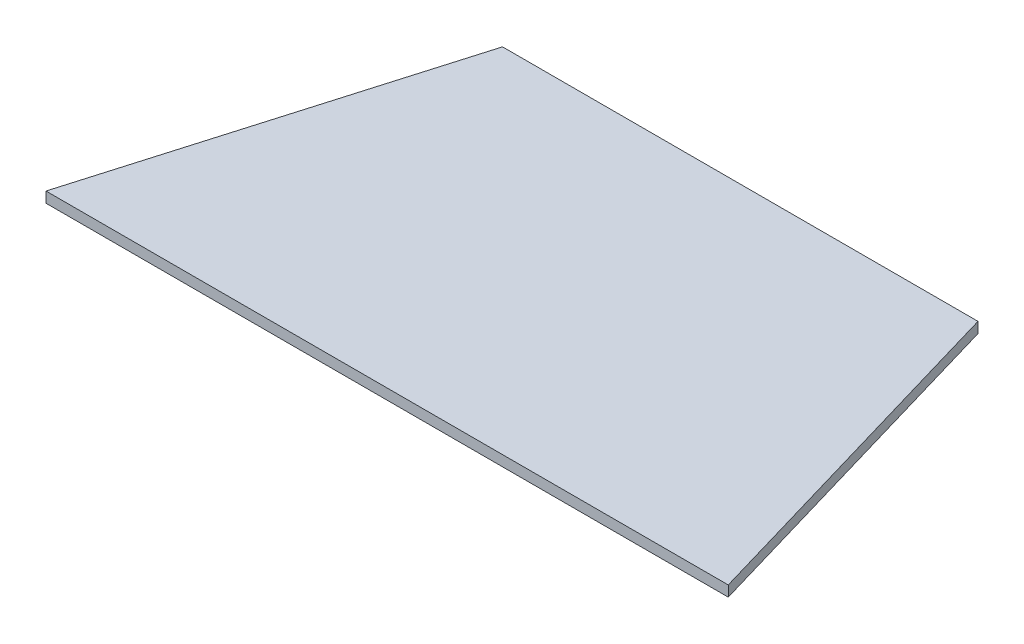
ISO-10303-21;
HEADER;
FILE_DESCRIPTION(('STEP AP214'),'2;1');
FILE_NAME('part.step','',(''),(''),'','','');
FILE_SCHEMA(('AUTOMOTIVE_DESIGN { 1 0 10303 214 1 1 1 1 }'));
ENDSEC;
DATA;
#1=APPLICATION_CONTEXT('core data for automotive mechanical design processes');
#2=APPLICATION_PROTOCOL_DEFINITION('international standard','automotive_design',2000,#1);
#3=PRODUCT_CONTEXT('',#1,'mechanical');
#4=PRODUCT('Part','Part','',(#3));
#5=PRODUCT_RELATED_PRODUCT_CATEGORY('part','',(#4));
#6=PRODUCT_DEFINITION_FORMATION('','',#4);
#7=PRODUCT_DEFINITION_CONTEXT('part definition',#1,'design');
#8=PRODUCT_DEFINITION('design','',#6,#7);
#9=PRODUCT_DEFINITION_SHAPE('','',#8);
#10=(LENGTH_UNIT() NAMED_UNIT(*) SI_UNIT(.MILLI.,.METRE.));
#11=(NAMED_UNIT(*) PLANE_ANGLE_UNIT() SI_UNIT($,.RADIAN.));
#12=(NAMED_UNIT(*) SI_UNIT($,.STERADIAN.) SOLID_ANGLE_UNIT());
#13=UNCERTAINTY_MEASURE_WITH_UNIT(LENGTH_MEASURE(1.E-05),#10,'distance_accuracy_value','');
#14=(GEOMETRIC_REPRESENTATION_CONTEXT(3) GLOBAL_UNCERTAINTY_ASSIGNED_CONTEXT((#13)) GLOBAL_UNIT_ASSIGNED_CONTEXT((#10,
#11,#12)) REPRESENTATION_CONTEXT('',''));
#15=CARTESIAN_POINT('',(0.,0.,0.));
#16=DIRECTION('',(0.,0.,1.));
#17=DIRECTION('',(1.,0.,0.));
#18=AXIS2_PLACEMENT_3D('',#15,#16,#17);
#19=CARTESIAN_POINT('',(-13.2,3.,0.));
#20=DIRECTION('',(0.959707262339068,0.,0.281001727065248));
#21=DIRECTION('',(0.281001727065248,0.,-0.959707262339068));
#22=AXIS2_PLACEMENT_3D('',#19,#20,#21);
#23=PLANE('',#22);
#24=DIRECTION('',(-0.281001727065247,0.,0.959707262339068));
#25=VECTOR('',#24,1.);
#26=CARTESIAN_POINT('',(-13.2,0.,0.));
#27=LINE('',#26,#25);
#28=CARTESIAN_POINT('',(16.0799417168491,0.,-100.));
#29=VERTEX_POINT('',#28);
#30=CARTESIAN_POINT('',(-13.2,0.,0.));
#31=VERTEX_POINT('',#30);
#32=EDGE_CURVE('E102',#29,#31,#27,.T.);
#33=ORIENTED_EDGE('',*,*,#32,.T.);
#34=DIRECTION('',(0.,-1.,0.));
#35=VECTOR('',#34,1.);
#36=CARTESIAN_POINT('',(-13.2,3.,0.));
#37=LINE('',#36,#35);
#38=CARTESIAN_POINT('',(-13.2,3.,0.));
#39=VERTEX_POINT('',#38);
#40=EDGE_CURVE('E11',#39,#31,#37,.T.);
#41=ORIENTED_EDGE('',*,*,#40,.F.);
#42=DIRECTION('',(-0.281001727065247,0.,0.959707262339068));
#43=VECTOR('',#42,1.);
#44=CARTESIAN_POINT('',(-13.2,3.,0.));
#45=LINE('',#44,#43);
#46=CARTESIAN_POINT('',(16.0799417168491,3.,-100.));
#47=VERTEX_POINT('',#46);
#48=EDGE_CURVE('E90',#47,#39,#45,.T.);
#49=ORIENTED_EDGE('',*,*,#48,.F.);
#50=DIRECTION('',(0.,-1.,0.));
#51=VECTOR('',#50,1.);
#52=CARTESIAN_POINT('',(16.0799417168491,3.,-100.));
#53=LINE('',#52,#51);
#54=EDGE_CURVE('E98',#47,#29,#53,.T.);
#55=ORIENTED_EDGE('',*,*,#54,.T.);
#56=EDGE_LOOP('',(#33,#41,#49,#55));
#57=FACE_BOUND('',#56,.T.);
#58=ADVANCED_FACE('F39',(#57),#23,.F.);
#59=CARTESIAN_POINT('',(-13.2,3.,0.));
#60=DIRECTION('',(0.,0.,-1.));
#61=DIRECTION('',(-1.,0.,0.));
#62=AXIS2_PLACEMENT_3D('',#59,#60,#61);
#63=PLANE('',#62);
#64=DIRECTION('',(1.,0.,0.));
#65=VECTOR('',#64,1.);
#66=CARTESIAN_POINT('',(-13.2,0.,0.));
#67=LINE('',#66,#65);
#68=CARTESIAN_POINT('',(180.,0.,0.));
#69=VERTEX_POINT('',#68);
#70=EDGE_CURVE('E94',#31,#69,#67,.T.);
#71=ORIENTED_EDGE('',*,*,#70,.T.);
#72=DIRECTION('',(0.,-1.,0.));
#73=VECTOR('',#72,1.);
#74=CARTESIAN_POINT('',(180.,3.,0.));
#75=LINE('',#74,#73);
#76=CARTESIAN_POINT('',(180.,3.,0.));
#77=VERTEX_POINT('',#76);
#78=EDGE_CURVE('E47',#77,#69,#75,.T.);
#79=ORIENTED_EDGE('',*,*,#78,.F.);
#80=DIRECTION('',(1.,0.,0.));
#81=VECTOR('',#80,1.);
#82=CARTESIAN_POINT('',(-13.2,3.,0.));
#83=LINE('',#82,#81);
#84=EDGE_CURVE('E85',#39,#77,#83,.T.);
#85=ORIENTED_EDGE('',*,*,#84,.F.);
#86=ORIENTED_EDGE('',*,*,#40,.T.);
#87=EDGE_LOOP('',(#71,#79,#85,#86));
#88=FACE_BOUND('',#87,.T.);
#89=ADVANCED_FACE('F93',(#88),#63,.F.);
#90=CARTESIAN_POINT('',(180.,3.,0.));
#91=DIRECTION('',(-0.959707262339066,0.,0.281001727065255));
#92=DIRECTION('',(0.281001727065255,0.,0.959707262339066));
#93=AXIS2_PLACEMENT_3D('',#90,#91,#92);
#94=PLANE('',#93);
#95=DIRECTION('',(-0.281001727065255,0.,-0.959707262339066));
#96=VECTOR('',#95,1.);
#97=CARTESIAN_POINT('',(180.,0.,0.));
#98=LINE('',#97,#96);
#99=CARTESIAN_POINT('',(150.72005828315,0.,-100.));
#100=VERTEX_POINT('',#99);
#101=EDGE_CURVE('E72',#69,#100,#98,.T.);
#102=ORIENTED_EDGE('',*,*,#101,.T.);
#103=DIRECTION('',(0.,-1.,0.));
#104=VECTOR('',#103,1.);
#105=CARTESIAN_POINT('',(150.72005828315,3.,-100.));
#106=LINE('',#105,#104);
#107=CARTESIAN_POINT('',(150.72005828315,3.,-100.));
#108=VERTEX_POINT('',#107);
#109=EDGE_CURVE('E95',#108,#100,#106,.T.);
#110=ORIENTED_EDGE('',*,*,#109,.F.);
#111=DIRECTION('',(-0.281001727065255,0.,-0.959707262339066));
#112=VECTOR('',#111,1.);
#113=CARTESIAN_POINT('',(180.,3.,0.));
#114=LINE('',#113,#112);
#115=EDGE_CURVE('E88',#77,#108,#114,.T.);
#116=ORIENTED_EDGE('',*,*,#115,.F.);
#117=ORIENTED_EDGE('',*,*,#78,.T.);
#118=EDGE_LOOP('',(#102,#110,#116,#117));
#119=FACE_BOUND('',#118,.T.);
#120=ADVANCED_FACE('F96',(#119),#94,.F.);
#121=CARTESIAN_POINT('',(16.0799417168491,3.,-100.));
#122=DIRECTION('',(0.,0.,1.));
#123=DIRECTION('',(1.,0.,0.));
#124=AXIS2_PLACEMENT_3D('',#121,#122,#123);
#125=PLANE('',#124);
#126=DIRECTION('',(-1.,0.,0.));
#127=VECTOR('',#126,1.);
#128=CARTESIAN_POINT('',(16.0799417168491,0.,-100.));
#129=LINE('',#128,#127);
#130=EDGE_CURVE('E78',#100,#29,#129,.T.);
#131=ORIENTED_EDGE('',*,*,#130,.T.);
#132=ORIENTED_EDGE('',*,*,#54,.F.);
#133=DIRECTION('',(-1.,0.,0.));
#134=VECTOR('',#133,1.);
#135=CARTESIAN_POINT('',(16.0799417168491,3.,-100.));
#136=LINE('',#135,#134);
#137=EDGE_CURVE('E55',#108,#47,#136,.T.);
#138=ORIENTED_EDGE('',*,*,#137,.F.);
#139=ORIENTED_EDGE('',*,*,#109,.T.);
#140=EDGE_LOOP('',(#131,#132,#138,#139));
#141=FACE_BOUND('',#140,.T.);
#142=ADVANCED_FACE('F109',(#141),#125,.F.);
#143=CARTESIAN_POINT('',(0.,3.,0.));
#144=DIRECTION('',(0.,-1.,0.));
#145=DIRECTION('',(0.,0.,-1.));
#146=AXIS2_PLACEMENT_3D('',#143,#144,#145);
#147=PLANE('',#146);
#148=ORIENTED_EDGE('',*,*,#48,.T.);
#149=ORIENTED_EDGE('',*,*,#84,.T.);
#150=ORIENTED_EDGE('',*,*,#115,.T.);
#151=ORIENTED_EDGE('',*,*,#137,.T.);
#152=EDGE_LOOP('',(#148,#149,#150,#151));
#153=FACE_BOUND('',#152,.T.);
#154=ADVANCED_FACE('F86',(#153),#147,.F.);
#155=CARTESIAN_POINT('',(0.,0.,0.));
#156=DIRECTION('',(0.,-1.,0.));
#157=DIRECTION('',(0.,0.,-1.));
#158=AXIS2_PLACEMENT_3D('',#155,#156,#157);
#159=PLANE('',#158);
#160=ORIENTED_EDGE('',*,*,#32,.F.);
#161=ORIENTED_EDGE('',*,*,#130,.F.);
#162=ORIENTED_EDGE('',*,*,#101,.F.);
#163=ORIENTED_EDGE('',*,*,#70,.F.);
#164=EDGE_LOOP('',(#160,#161,#162,#163));
#165=FACE_BOUND('',#164,.T.);
#166=ADVANCED_FACE('F112',(#165),#159,.T.);
#167=CLOSED_SHELL('',(#58,#89,#120,#142,#154,#166));
#168=MANIFOLD_SOLID_BREP('B2',#167);
#169=ADVANCED_BREP_SHAPE_REPRESENTATION('',(#18,#168),#14);
#170=SHAPE_DEFINITION_REPRESENTATION(#9,#169);
ENDSEC;
END-ISO-10303-21;
